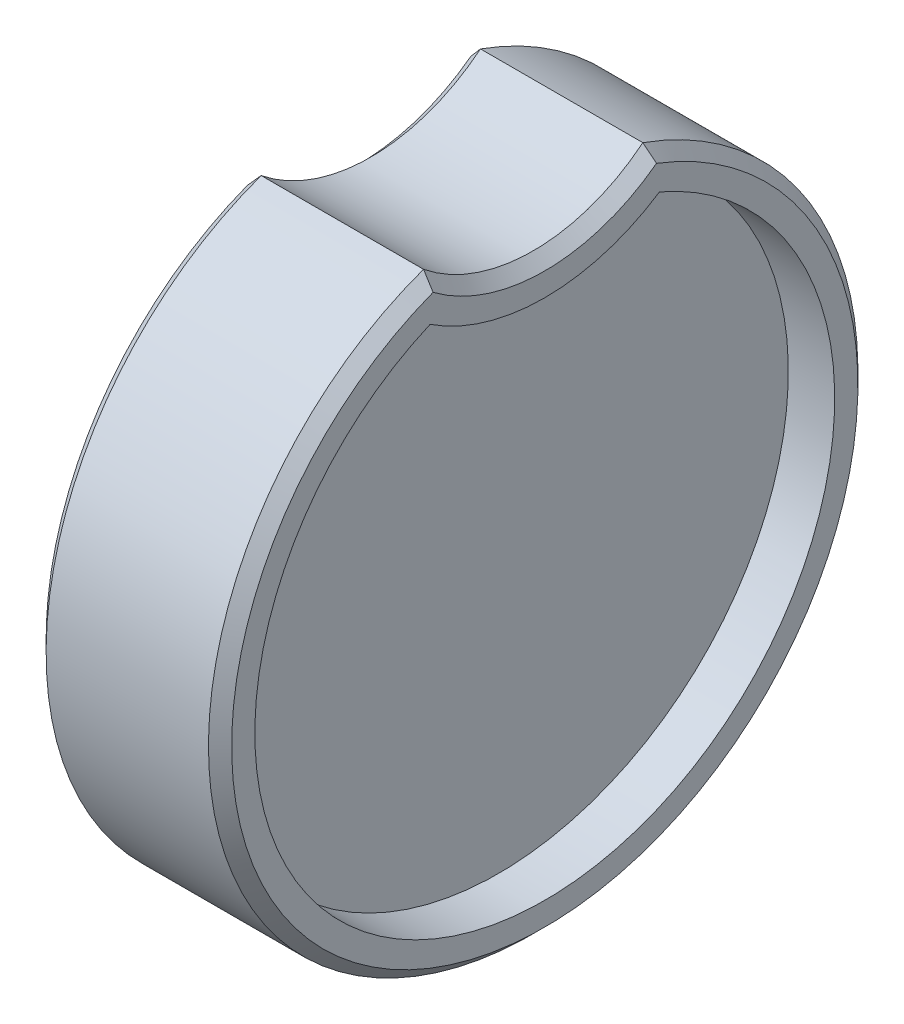
ISO-10303-21;
HEADER;
FILE_DESCRIPTION(('STEP AP214'),'2;1');
FILE_NAME('part.step','',(''),(''),'','','');
FILE_SCHEMA(('AUTOMOTIVE_DESIGN { 1 0 10303 214 1 1 1 1 }'));
ENDSEC;
DATA;
#1=APPLICATION_CONTEXT('core data for automotive mechanical design processes');
#2=APPLICATION_PROTOCOL_DEFINITION('international standard','automotive_design',2000,#1);
#3=PRODUCT_CONTEXT('',#1,'mechanical');
#4=PRODUCT('Part','Part','',(#3));
#5=PRODUCT_RELATED_PRODUCT_CATEGORY('part','',(#4));
#6=PRODUCT_DEFINITION_FORMATION('','',#4);
#7=PRODUCT_DEFINITION_CONTEXT('part definition',#1,'design');
#8=PRODUCT_DEFINITION('design','',#6,#7);
#9=PRODUCT_DEFINITION_SHAPE('','',#8);
#10=(LENGTH_UNIT() NAMED_UNIT(*) SI_UNIT(.MILLI.,.METRE.));
#11=(NAMED_UNIT(*) PLANE_ANGLE_UNIT() SI_UNIT($,.RADIAN.));
#12=(NAMED_UNIT(*) SI_UNIT($,.STERADIAN.) SOLID_ANGLE_UNIT());
#13=UNCERTAINTY_MEASURE_WITH_UNIT(LENGTH_MEASURE(1.E-05),#10,'distance_accuracy_value','');
#14=(GEOMETRIC_REPRESENTATION_CONTEXT(3) GLOBAL_UNCERTAINTY_ASSIGNED_CONTEXT((#13)) GLOBAL_UNIT_ASSIGNED_CONTEXT((#10,
#11,#12)) REPRESENTATION_CONTEXT('',''));
#15=CARTESIAN_POINT('',(0.,0.,0.));
#16=DIRECTION('',(0.,0.,1.));
#17=DIRECTION('',(1.,0.,0.));
#18=AXIS2_PLACEMENT_3D('',#15,#16,#17);
#19=CARTESIAN_POINT('',(8.,0.,0.));
#20=DIRECTION('',(-1.,0.,0.));
#21=DIRECTION('',(0.,0.,1.));
#22=AXIS2_PLACEMENT_3D('',#19,#20,#21);
#23=CYLINDRICAL_SURFACE('',#22,28.);
#24=DIRECTION('',(1.,0.,0.));
#25=VECTOR('',#24,1.);
#26=CARTESIAN_POINT('',(0.,26.3552631578947,9.45516281605539));
#27=LINE('',#26,#25);
#28=CARTESIAN_POINT('',(6.99999999999999,26.3552631578947,9.45516281605539));
#29=VERTEX_POINT('',#28);
#30=CARTESIAN_POINT('',(-7.,26.3552631578947,9.45516281605539));
#31=VERTEX_POINT('',#30);
#32=EDGE_CURVE('E155',#29,#31,#27,.F.);
#33=ORIENTED_EDGE('',*,*,#32,.T.);
#34=CARTESIAN_POINT('',(-7.,0.,0.));
#35=DIRECTION('',(1.,0.,0.));
#36=DIRECTION('',(0.,0.,-1.));
#37=AXIS2_PLACEMENT_3D('',#34,#35,#36);
#38=CIRCLE('',#37,28.);
#39=CARTESIAN_POINT('',(-7.,26.3552631578947,-9.45516281605539));
#40=VERTEX_POINT('',#39);
#41=EDGE_CURVE('E175',#31,#40,#38,.T.);
#42=ORIENTED_EDGE('',*,*,#41,.T.);
#43=DIRECTION('',(1.,0.,0.));
#44=VECTOR('',#43,1.);
#45=CARTESIAN_POINT('',(0.,26.3552631578947,-9.45516281605539));
#46=LINE('',#45,#44);
#47=CARTESIAN_POINT('',(6.99999999999999,26.3552631578947,-9.45516281605539));
#48=VERTEX_POINT('',#47);
#49=EDGE_CURVE('E158',#40,#48,#46,.T.);
#50=ORIENTED_EDGE('',*,*,#49,.T.);
#51=CARTESIAN_POINT('',(6.99999999999999,0.,0.));
#52=DIRECTION('',(1.,0.,0.));
#53=DIRECTION('',(0.,0.,-1.));
#54=AXIS2_PLACEMENT_3D('',#51,#52,#53);
#55=CIRCLE('',#54,28.);
#56=EDGE_CURVE('E172',#48,#29,#55,.F.);
#57=ORIENTED_EDGE('',*,*,#56,.T.);
#58=EDGE_LOOP('',(#33,#42,#50,#57));
#59=FACE_BOUND('',#58,.T.);
#60=ADVANCED_FACE('F47',(#59),#23,.T.);
#61=CARTESIAN_POINT('',(8.,0.,0.));
#62=DIRECTION('',(1.,0.,0.));
#63=DIRECTION('',(0.,0.,-1.));
#64=AXIS2_PLACEMENT_3D('',#61,#62,#63);
#65=PLANE('',#64);
#66=CARTESIAN_POINT('',(8.,38.,0.));
#67=DIRECTION('',(-1.,0.,0.));
#68=DIRECTION('',(0.,0.,-1.));
#69=AXIS2_PLACEMENT_3D('',#66,#67,#68);
#70=CIRCLE('',#69,18.);
#71=CARTESIAN_POINT('',(8.,22.9605263157895,-9.89010774976385));
#72=VERTEX_POINT('',#71);
#73=CARTESIAN_POINT('',(8.,22.9605263157895,9.89010774976386));
#74=VERTEX_POINT('',#73);
#75=EDGE_CURVE('E78',#72,#74,#70,.T.);
#76=ORIENTED_EDGE('',*,*,#75,.F.);
#77=CARTESIAN_POINT('',(8.,0.,0.));
#78=DIRECTION('',(1.,0.,0.));
#79=DIRECTION('',(0.,0.,-1.));
#80=AXIS2_PLACEMENT_3D('',#77,#78,#79);
#81=CIRCLE('',#80,25.);
#82=EDGE_CURVE('E144',#74,#72,#81,.T.);
#83=ORIENTED_EDGE('',*,*,#82,.F.);
#84=EDGE_LOOP('',(#76,#83));
#85=FACE_BOUND('',#84,.T.);
#86=CARTESIAN_POINT('',(8.,38.,0.));
#87=DIRECTION('',(1.,0.,0.));
#88=DIRECTION('',(0.,0.,-1.));
#89=AXIS2_PLACEMENT_3D('',#86,#87,#88);
#90=CIRCLE('',#89,16.);
#91=CARTESIAN_POINT('',(8.,25.2236842105263,-9.6314980583316));
#92=VERTEX_POINT('',#91);
#93=CARTESIAN_POINT('',(8.,25.2236842105263,9.6314980583316));
#94=VERTEX_POINT('',#93);
#95=EDGE_CURVE('E62',#92,#94,#90,.F.);
#96=ORIENTED_EDGE('',*,*,#95,.T.);
#97=CARTESIAN_POINT('',(8.,0.,0.));
#98=DIRECTION('',(1.,0.,0.));
#99=DIRECTION('',(0.,0.,-1.));
#100=AXIS2_PLACEMENT_3D('',#97,#98,#99);
#101=CIRCLE('',#100,27.);
#102=EDGE_CURVE('E12',#94,#92,#101,.T.);
#103=ORIENTED_EDGE('',*,*,#102,.T.);
#104=EDGE_LOOP('',(#96,#103));
#105=FACE_BOUND('',#104,.T.);
#106=ADVANCED_FACE('F236',(#85,#105),#65,.T.);
#107=CARTESIAN_POINT('',(-8.,0.,0.));
#108=DIRECTION('',(1.,0.,0.));
#109=DIRECTION('',(0.,0.,-1.));
#110=AXIS2_PLACEMENT_3D('',#107,#108,#109);
#111=PLANE('',#110);
#112=CARTESIAN_POINT('',(-8.,38.,0.));
#113=DIRECTION('',(-1.,0.,0.));
#114=DIRECTION('',(0.,0.,-1.));
#115=AXIS2_PLACEMENT_3D('',#112,#113,#114);
#116=CIRCLE('',#115,18.);
#117=CARTESIAN_POINT('',(-8.,22.9605263157895,-9.89010774976385));
#118=VERTEX_POINT('',#117);
#119=CARTESIAN_POINT('',(-8.,22.9605263157895,9.89010774976386));
#120=VERTEX_POINT('',#119);
#121=EDGE_CURVE('E70',#118,#120,#116,.T.);
#122=ORIENTED_EDGE('',*,*,#121,.T.);
#123=CARTESIAN_POINT('',(-8.,0.,0.));
#124=DIRECTION('',(1.,0.,0.));
#125=DIRECTION('',(0.,0.,-1.));
#126=AXIS2_PLACEMENT_3D('',#123,#124,#125);
#127=CIRCLE('',#126,25.);
#128=EDGE_CURVE('E134',#120,#118,#127,.T.);
#129=ORIENTED_EDGE('',*,*,#128,.T.);
#130=EDGE_LOOP('',(#122,#129));
#131=FACE_BOUND('',#130,.T.);
#132=CARTESIAN_POINT('',(-8.,0.,0.));
#133=DIRECTION('',(1.,0.,0.));
#134=DIRECTION('',(0.,0.,-1.));
#135=AXIS2_PLACEMENT_3D('',#132,#133,#134);
#136=CIRCLE('',#135,27.);
#137=CARTESIAN_POINT('',(-8.,25.2236842105263,-9.6314980583316));
#138=VERTEX_POINT('',#137);
#139=CARTESIAN_POINT('',(-8.,25.2236842105263,9.6314980583316));
#140=VERTEX_POINT('',#139);
#141=EDGE_CURVE('E162',#138,#140,#136,.F.);
#142=ORIENTED_EDGE('',*,*,#141,.T.);
#143=CARTESIAN_POINT('',(-8.,38.,0.));
#144=DIRECTION('',(1.,0.,0.));
#145=DIRECTION('',(0.,0.,-1.));
#146=AXIS2_PLACEMENT_3D('',#143,#144,#145);
#147=CIRCLE('',#146,16.);
#148=EDGE_CURVE('E164',#140,#138,#147,.T.);
#149=ORIENTED_EDGE('',*,*,#148,.T.);
#150=EDGE_LOOP('',(#142,#149));
#151=FACE_BOUND('',#150,.T.);
#152=ADVANCED_FACE('F234',(#131,#151),#111,.F.);
#153=CARTESIAN_POINT('',(-8.,38.,0.));
#154=DIRECTION('',(1.,0.,0.));
#155=DIRECTION('',(0.,0.,-1.));
#156=AXIS2_PLACEMENT_3D('',#153,#154,#155);
#157=CYLINDRICAL_SURFACE('',#156,15.);
#158=ORIENTED_EDGE('',*,*,#49,.F.);
#159=CARTESIAN_POINT('',(-7.,38.,0.));
#160=DIRECTION('',(1.,0.,0.));
#161=DIRECTION('',(0.,0.,-1.));
#162=AXIS2_PLACEMENT_3D('',#159,#160,#161);
#163=CIRCLE('',#162,15.);
#164=EDGE_CURVE('E169',#40,#31,#163,.F.);
#165=ORIENTED_EDGE('',*,*,#164,.T.);
#166=ORIENTED_EDGE('',*,*,#32,.F.);
#167=CARTESIAN_POINT('',(6.99999999999999,38.,0.));
#168=DIRECTION('',(1.,0.,0.));
#169=DIRECTION('',(0.,0.,-1.));
#170=AXIS2_PLACEMENT_3D('',#167,#168,#169);
#171=CIRCLE('',#170,15.);
#172=EDGE_CURVE('E167',#29,#48,#171,.T.);
#173=ORIENTED_EDGE('',*,*,#172,.T.);
#174=EDGE_LOOP('',(#158,#165,#166,#173));
#175=FACE_BOUND('',#174,.T.);
#176=ADVANCED_FACE('F225',(#175),#157,.F.);
#177=CARTESIAN_POINT('',(-7.,0.,0.));
#178=DIRECTION('',(1.,0.,0.));
#179=DIRECTION('',(0.,0.,-1.));
#180=AXIS2_PLACEMENT_3D('',#177,#178,#179);
#181=CONICAL_SURFACE('',#180,28.,0.78539816339745);
#182=CARTESIAN_POINT('',(-8.,25.2236842105263,-9.6314980583316));
#183=CARTESIAN_POINT('',(-7.83312590809545,25.4125154197867,-9.60479232446551));
#184=CARTESIAN_POINT('',(-7.66635556416649,25.6012292300221,-9.57674486082182));
#185=CARTESIAN_POINT('',(-7.33302223065687,25.9784222126778,-9.51796644900966));
#186=CARTESIAN_POINT('',(-7.16645924125249,26.1669013848985,-9.48723549856128));
#187=CARTESIAN_POINT('',(-7.,26.3552631578947,-9.45516281605538));
#188=B_SPLINE_CURVE_WITH_KNOTS('',3,(#182,#183,#184,#185,#186,#187),.UNSPECIFIED.,.F.,.F.,(4,2,
4),(0.,0.76020207184753,1.52040478957631),.UNSPECIFIED.);
#189=EDGE_CURVE('E178',#40,#138,#188,.F.);
#190=ORIENTED_EDGE('',*,*,#189,.F.);
#191=ORIENTED_EDGE('',*,*,#41,.F.);
#192=CARTESIAN_POINT('',(-7.,26.3552631578947,9.45516281605539));
#193=CARTESIAN_POINT('',(-7.16645924125249,26.1669013848985,9.48723549856128));
#194=CARTESIAN_POINT('',(-7.33302223065687,25.9784222126778,9.51796644900966));
#195=CARTESIAN_POINT('',(-7.6663555641665,25.6012292300221,9.57674486082182));
#196=CARTESIAN_POINT('',(-7.83312590809545,25.4125154197867,9.60479232446551));
#197=CARTESIAN_POINT('',(-8.,25.2236842105263,9.6314980583316));
#198=B_SPLINE_CURVE_WITH_KNOTS('',3,(#192,#193,#194,#195,#196,#197),.UNSPECIFIED.,.F.,.F.,(4,2,
4),(0.,0.760202717728779,1.52040478957631),.UNSPECIFIED.);
#199=EDGE_CURVE('E159',#140,#31,#198,.F.);
#200=ORIENTED_EDGE('',*,*,#199,.F.);
#201=ORIENTED_EDGE('',*,*,#141,.F.);
#202=EDGE_LOOP('',(#190,#191,#200,#201));
#203=FACE_BOUND('',#202,.T.);
#204=ADVANCED_FACE('F191',(#203),#181,.T.);
#205=CARTESIAN_POINT('',(-8.,38.,0.));
#206=DIRECTION('',(-1.,0.,0.));
#207=DIRECTION('',(0.,0.,1.));
#208=AXIS2_PLACEMENT_3D('',#205,#206,#207);
#209=CONICAL_SURFACE('',#208,16.,0.78539816339745);
#210=ORIENTED_EDGE('',*,*,#199,.T.);
#211=ORIENTED_EDGE('',*,*,#164,.F.);
#212=ORIENTED_EDGE('',*,*,#189,.T.);
#213=ORIENTED_EDGE('',*,*,#148,.F.);
#214=EDGE_LOOP('',(#210,#211,#212,#213));
#215=FACE_BOUND('',#214,.T.);
#216=ADVANCED_FACE('F195',(#215),#209,.F.);
#217=CARTESIAN_POINT('',(6.99999999999999,38.,0.));
#218=DIRECTION('',(1.,0.,0.));
#219=DIRECTION('',(0.,0.,-1.));
#220=AXIS2_PLACEMENT_3D('',#217,#218,#219);
#221=CONICAL_SURFACE('',#220,15.,0.785398163397449);
#222=CARTESIAN_POINT('',(8.,25.2236842105263,-9.6314980583316));
#223=CARTESIAN_POINT('',(7.83312590809545,25.4125154197867,-9.60479232446551));
#224=CARTESIAN_POINT('',(7.66635556416649,25.6012292300221,-9.57674486082182));
#225=CARTESIAN_POINT('',(7.33302223065686,25.9784222126778,-9.51796644900966));
#226=CARTESIAN_POINT('',(7.16645924125248,26.1669013848985,-9.48723549856128));
#227=CARTESIAN_POINT('',(6.99999999999999,26.3552631578947,-9.45516281605538));
#228=B_SPLINE_CURVE_WITH_KNOTS('',3,(#222,#223,#224,#225,#226,#227),.UNSPECIFIED.,.F.,.F.,(4,2,
4),(0.,0.760202071847537,1.52040478957632),.UNSPECIFIED.);
#229=EDGE_CURVE('E153',#48,#92,#228,.F.);
#230=ORIENTED_EDGE('',*,*,#229,.F.);
#231=ORIENTED_EDGE('',*,*,#172,.F.);
#232=CARTESIAN_POINT('',(6.99999999999999,26.3552631578947,9.45516281605539));
#233=CARTESIAN_POINT('',(7.16645924125248,26.1669013848985,9.48723549856128));
#234=CARTESIAN_POINT('',(7.33302223065686,25.9784222126778,9.51796644900967));
#235=CARTESIAN_POINT('',(7.66635556416649,25.6012292300221,9.57674486082182));
#236=CARTESIAN_POINT('',(7.83312590809545,25.4125154197867,9.60479232446551));
#237=CARTESIAN_POINT('',(8.,25.2236842105263,9.6314980583316));
#238=B_SPLINE_CURVE_WITH_KNOTS('',3,(#232,#233,#234,#235,#236,#237),.UNSPECIFIED.,.F.,.F.,(4,2,
4),(0.,0.760202717728785,1.52040478957632),.UNSPECIFIED.);
#239=EDGE_CURVE('E53',#94,#29,#238,.F.);
#240=ORIENTED_EDGE('',*,*,#239,.F.);
#241=ORIENTED_EDGE('',*,*,#95,.F.);
#242=EDGE_LOOP('',(#230,#231,#240,#241));
#243=FACE_BOUND('',#242,.T.);
#244=ADVANCED_FACE('F200',(#243),#221,.F.);
#245=CARTESIAN_POINT('',(8.,0.,0.));
#246=DIRECTION('',(-1.,0.,0.));
#247=DIRECTION('',(0.,0.,1.));
#248=AXIS2_PLACEMENT_3D('',#245,#246,#247);
#249=CONICAL_SURFACE('',#248,27.,0.785398163397449);
#250=ORIENTED_EDGE('',*,*,#239,.T.);
#251=ORIENTED_EDGE('',*,*,#56,.F.);
#252=ORIENTED_EDGE('',*,*,#229,.T.);
#253=ORIENTED_EDGE('',*,*,#102,.F.);
#254=EDGE_LOOP('',(#250,#251,#252,#253));
#255=FACE_BOUND('',#254,.T.);
#256=ADVANCED_FACE('F50',(#255),#249,.T.);
#257=CARTESIAN_POINT('',(4.,38.,0.));
#258=DIRECTION('',(1.,0.,0.));
#259=DIRECTION('',(0.,0.,-1.));
#260=AXIS2_PLACEMENT_3D('',#257,#258,#259);
#261=CYLINDRICAL_SURFACE('',#260,18.);
#262=ORIENTED_EDGE('',*,*,#75,.T.);
#263=DIRECTION('',(1.,0.,0.));
#264=VECTOR('',#263,1.);
#265=CARTESIAN_POINT('',(4.,22.9605263157895,9.89010774976386));
#266=LINE('',#265,#264);
#267=CARTESIAN_POINT('',(4.,22.9605263157895,9.89010774976386));
#268=VERTEX_POINT('',#267);
#269=EDGE_CURVE('E147',#268,#74,#266,.T.);
#270=ORIENTED_EDGE('',*,*,#269,.F.);
#271=CARTESIAN_POINT('',(4.,38.,0.));
#272=DIRECTION('',(-1.,0.,0.));
#273=DIRECTION('',(0.,0.,-1.));
#274=AXIS2_PLACEMENT_3D('',#271,#272,#273);
#275=CIRCLE('',#274,18.);
#276=CARTESIAN_POINT('',(4.,22.9605263157895,-9.89010774976385));
#277=VERTEX_POINT('',#276);
#278=EDGE_CURVE('E140',#277,#268,#275,.T.);
#279=ORIENTED_EDGE('',*,*,#278,.F.);
#280=DIRECTION('',(1.,0.,0.));
#281=VECTOR('',#280,1.);
#282=CARTESIAN_POINT('',(4.,22.9605263157895,-9.89010774976385));
#283=LINE('',#282,#281);
#284=EDGE_CURVE('E151',#277,#72,#283,.T.);
#285=ORIENTED_EDGE('',*,*,#284,.T.);
#286=EDGE_LOOP('',(#262,#270,#279,#285));
#287=FACE_BOUND('',#286,.T.);
#288=ADVANCED_FACE('F279',(#287),#261,.T.);
#289=CARTESIAN_POINT('',(4.,0.,0.));
#290=DIRECTION('',(1.,0.,0.));
#291=DIRECTION('',(0.,0.,-1.));
#292=AXIS2_PLACEMENT_3D('',#289,#290,#291);
#293=CYLINDRICAL_SURFACE('',#292,25.);
#294=ORIENTED_EDGE('',*,*,#82,.T.);
#295=ORIENTED_EDGE('',*,*,#284,.F.);
#296=CARTESIAN_POINT('',(4.,0.,0.));
#297=DIRECTION('',(1.,0.,0.));
#298=DIRECTION('',(0.,0.,-1.));
#299=AXIS2_PLACEMENT_3D('',#296,#297,#298);
#300=CIRCLE('',#299,25.);
#301=EDGE_CURVE('E143',#268,#277,#300,.T.);
#302=ORIENTED_EDGE('',*,*,#301,.F.);
#303=ORIENTED_EDGE('',*,*,#269,.T.);
#304=EDGE_LOOP('',(#294,#295,#302,#303));
#305=FACE_BOUND('',#304,.T.);
#306=ADVANCED_FACE('F291',(#305),#293,.F.);
#307=CARTESIAN_POINT('',(4.,19.,0.));
#308=DIRECTION('',(1.,0.,0.));
#309=DIRECTION('',(0.,0.,-1.));
#310=AXIS2_PLACEMENT_3D('',#307,#308,#309);
#311=PLANE('',#310);
#312=ORIENTED_EDGE('',*,*,#278,.T.);
#313=ORIENTED_EDGE('',*,*,#301,.T.);
#314=EDGE_LOOP('',(#312,#313));
#315=FACE_BOUND('',#314,.T.);
#316=ADVANCED_FACE('F298',(#315),#311,.T.);
#317=CARTESIAN_POINT('',(-4.,38.,0.));
#318=DIRECTION('',(-1.,0.,0.));
#319=DIRECTION('',(0.,0.,1.));
#320=AXIS2_PLACEMENT_3D('',#317,#318,#319);
#321=CYLINDRICAL_SURFACE('',#320,18.);
#322=ORIENTED_EDGE('',*,*,#121,.F.);
#323=DIRECTION('',(-1.,0.,0.));
#324=VECTOR('',#323,1.);
#325=CARTESIAN_POINT('',(-4.,22.9605263157895,-9.89010774976385));
#326=LINE('',#325,#324);
#327=CARTESIAN_POINT('',(-4.,22.9605263157895,-9.89010774976385));
#328=VERTEX_POINT('',#327);
#329=EDGE_CURVE('E123',#328,#118,#326,.T.);
#330=ORIENTED_EDGE('',*,*,#329,.F.);
#331=CARTESIAN_POINT('',(-4.,38.,0.));
#332=DIRECTION('',(-1.,0.,0.));
#333=DIRECTION('',(0.,0.,-1.));
#334=AXIS2_PLACEMENT_3D('',#331,#332,#333);
#335=CIRCLE('',#334,18.);
#336=CARTESIAN_POINT('',(-4.,22.9605263157895,9.89010774976386));
#337=VERTEX_POINT('',#336);
#338=EDGE_CURVE('E129',#328,#337,#335,.T.);
#339=ORIENTED_EDGE('',*,*,#338,.T.);
#340=DIRECTION('',(-1.,0.,0.));
#341=VECTOR('',#340,1.);
#342=CARTESIAN_POINT('',(-4.,22.9605263157895,9.89010774976386));
#343=LINE('',#342,#341);
#344=EDGE_CURVE('E125',#337,#120,#343,.T.);
#345=ORIENTED_EDGE('',*,*,#344,.T.);
#346=EDGE_LOOP('',(#322,#330,#339,#345));
#347=FACE_BOUND('',#346,.T.);
#348=ADVANCED_FACE('F131',(#347),#321,.T.);
#349=CARTESIAN_POINT('',(-4.,0.,0.));
#350=DIRECTION('',(-1.,0.,0.));
#351=DIRECTION('',(0.,0.,1.));
#352=AXIS2_PLACEMENT_3D('',#349,#350,#351);
#353=CYLINDRICAL_SURFACE('',#352,25.);
#354=ORIENTED_EDGE('',*,*,#128,.F.);
#355=ORIENTED_EDGE('',*,*,#344,.F.);
#356=CARTESIAN_POINT('',(-4.,0.,0.));
#357=DIRECTION('',(1.,0.,0.));
#358=DIRECTION('',(0.,0.,-1.));
#359=AXIS2_PLACEMENT_3D('',#356,#357,#358);
#360=CIRCLE('',#359,25.);
#361=EDGE_CURVE('E121',#337,#328,#360,.T.);
#362=ORIENTED_EDGE('',*,*,#361,.T.);
#363=ORIENTED_EDGE('',*,*,#329,.T.);
#364=EDGE_LOOP('',(#354,#355,#362,#363));
#365=FACE_BOUND('',#364,.T.);
#366=ADVANCED_FACE('F122',(#365),#353,.F.);
#367=CARTESIAN_POINT('',(-4.,19.,0.));
#368=DIRECTION('',(-1.,0.,0.));
#369=DIRECTION('',(0.,0.,-1.));
#370=AXIS2_PLACEMENT_3D('',#367,#368,#369);
#371=PLANE('',#370);
#372=ORIENTED_EDGE('',*,*,#338,.F.);
#373=ORIENTED_EDGE('',*,*,#361,.F.);
#374=EDGE_LOOP('',(#372,#373));
#375=FACE_BOUND('',#374,.T.);
#376=ADVANCED_FACE('F133',(#375),#371,.T.);
#377=CLOSED_SHELL('',(#60,#106,#152,#176,#204,#216,#244,#256,#288,#306,#316,#348,#366,#376));
#378=MANIFOLD_SOLID_BREP('B2',#377);
#379=ADVANCED_BREP_SHAPE_REPRESENTATION('',(#18,#378),#14);
#380=SHAPE_DEFINITION_REPRESENTATION(#9,#379);
ENDSEC;
END-ISO-10303-21;
